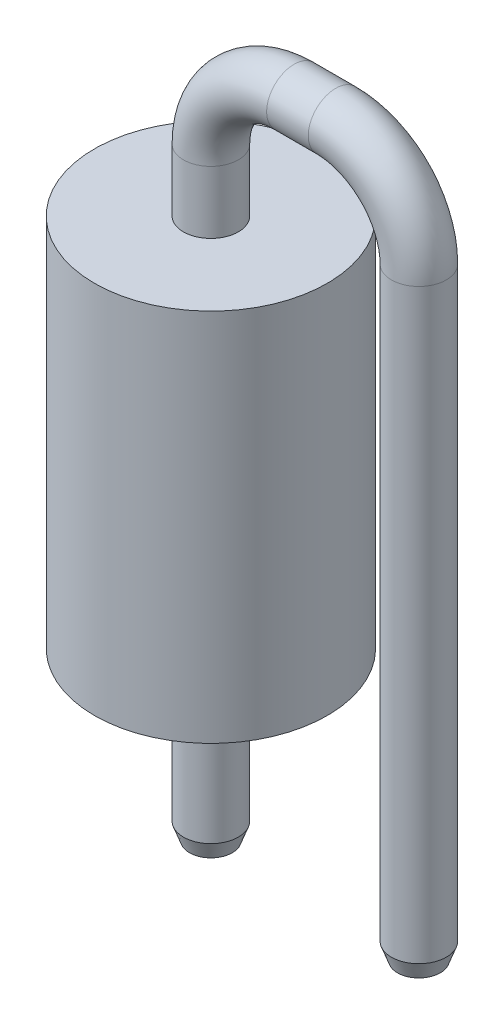
ISO-10303-21;
HEADER;
FILE_DESCRIPTION(('STEP AP214'),'2;1');
FILE_NAME('part.step','',(''),(''),'','','');
FILE_SCHEMA(('AUTOMOTIVE_DESIGN { 1 0 10303 214 1 1 1 1 }'));
ENDSEC;
DATA;
#1=APPLICATION_CONTEXT('core data for automotive mechanical design processes');
#2=APPLICATION_PROTOCOL_DEFINITION('international standard','automotive_design',2000,#1);
#3=PRODUCT_CONTEXT('',#1,'mechanical');
#4=PRODUCT('Part','Part','',(#3));
#5=PRODUCT_RELATED_PRODUCT_CATEGORY('part','',(#4));
#6=PRODUCT_DEFINITION_FORMATION('','',#4);
#7=PRODUCT_DEFINITION_CONTEXT('part definition',#1,'design');
#8=PRODUCT_DEFINITION('design','',#6,#7);
#9=PRODUCT_DEFINITION_SHAPE('','',#8);
#10=(LENGTH_UNIT() NAMED_UNIT(*) SI_UNIT(.MILLI.,.METRE.));
#11=(NAMED_UNIT(*) PLANE_ANGLE_UNIT() SI_UNIT($,.RADIAN.));
#12=(NAMED_UNIT(*) SI_UNIT($,.STERADIAN.) SOLID_ANGLE_UNIT());
#13=UNCERTAINTY_MEASURE_WITH_UNIT(LENGTH_MEASURE(1.E-05),#10,'distance_accuracy_value','');
#14=(GEOMETRIC_REPRESENTATION_CONTEXT(3) GLOBAL_UNCERTAINTY_ASSIGNED_CONTEXT((#13)) GLOBAL_UNIT_ASSIGNED_CONTEXT((#10,
#11,#12)) REPRESENTATION_CONTEXT('',''));
#15=CARTESIAN_POINT('',(0.,0.,0.));
#16=DIRECTION('',(0.,0.,1.));
#17=DIRECTION('',(1.,0.,0.));
#18=AXIS2_PLACEMENT_3D('',#15,#16,#17);
#19=CARTESIAN_POINT('',(5.,14.5,0.));
#20=DIRECTION('',(0.,-1.,0.));
#21=DIRECTION('',(1.,0.,0.));
#22=AXIS2_PLACEMENT_3D('',#19,#20,#21);
#23=CYLINDRICAL_SURFACE('',#22,0.66);
#24=CARTESIAN_POINT('',(5.,0.39999999999997,0.));
#25=DIRECTION('',(0.,-1.,0.));
#26=DIRECTION('',(0.,0.,-1.));
#27=AXIS2_PLACEMENT_3D('',#24,#25,#26);
#28=CIRCLE('',#27,0.66);
#29=CARTESIAN_POINT('',(5.,0.39999999999997,-0.66));
#30=VERTEX_POINT('',#29);
#31=EDGE_CURVE('E56',#30,#30,#28,.F.);
#32=ORIENTED_EDGE('',*,*,#31,.T.);
#33=EDGE_LOOP('',(#32));
#34=FACE_BOUND('',#33,.T.);
#35=CARTESIAN_POINT('',(5.,14.5,0.));
#36=DIRECTION('',(0.,-1.,0.));
#37=DIRECTION('',(0.,0.,1.));
#38=AXIS2_PLACEMENT_3D('',#35,#36,#37);
#39=CIRCLE('',#38,0.66);
#40=CARTESIAN_POINT('',(5.66,14.5,0.));
#41=VERTEX_POINT('',#40);
#42=EDGE_CURVE('E77',#41,#41,#39,.T.);
#43=ORIENTED_EDGE('',*,*,#42,.T.);
#44=EDGE_LOOP('',(#43));
#45=FACE_BOUND('',#44,.T.);
#46=ADVANCED_FACE('F41',(#34,#45),#23,.T.);
#47=CARTESIAN_POINT('',(3.,14.5,0.));
#48=DIRECTION('',(0.,0.,-1.));
#49=DIRECTION('',(-1.,0.,0.));
#50=AXIS2_PLACEMENT_3D('',#47,#48,#49);
#51=TOROIDAL_SURFACE('',#50,2.,0.66);
#52=CARTESIAN_POINT('',(3.,16.5,0.));
#53=DIRECTION('',(1.,0.,0.));
#54=DIRECTION('',(0.,0.,1.));
#55=AXIS2_PLACEMENT_3D('',#52,#53,#54);
#56=CIRCLE('',#55,0.66);
#57=CARTESIAN_POINT('',(3.,17.16,0.));
#58=VERTEX_POINT('',#57);
#59=EDGE_CURVE('E80',#58,#58,#56,.T.);
#60=CARTESIAN_POINT('',(3.,14.5,0.));
#61=DIRECTION('',(0.,0.,-1.));
#62=DIRECTION('',(-1.,0.,0.));
#63=AXIS2_PLACEMENT_3D('',#60,#61,#62);
#64=CIRCLE('',#63,2.66);
#65=EDGE_CURVE('',#58,#41,#64,.T.);
#66=ORIENTED_EDGE('',*,*,#59,.T.);
#67=ORIENTED_EDGE('',*,*,#42,.F.);
#68=ORIENTED_EDGE('',*,*,#65,.T.);
#69=ORIENTED_EDGE('',*,*,#65,.F.);
#70=EDGE_LOOP('',(#66,#68,#67,#69));
#71=FACE_BOUND('',#70,.T.);
#72=ADVANCED_FACE('F132',(#71),#51,.T.);
#73=CARTESIAN_POINT('',(2.,16.5,0.));
#74=DIRECTION('',(1.,0.,0.));
#75=DIRECTION('',(0.,1.,0.));
#76=AXIS2_PLACEMENT_3D('',#73,#74,#75);
#77=CYLINDRICAL_SURFACE('',#76,0.66);
#78=CARTESIAN_POINT('',(2.,16.5,0.));
#79=DIRECTION('',(1.,0.,0.));
#80=DIRECTION('',(0.,0.,1.));
#81=AXIS2_PLACEMENT_3D('',#78,#79,#80);
#82=CIRCLE('',#81,0.66);
#83=CARTESIAN_POINT('',(2.,17.16,0.));
#84=VERTEX_POINT('',#83);
#85=EDGE_CURVE('E84',#84,#84,#82,.T.);
#86=ORIENTED_EDGE('',*,*,#85,.T.);
#87=EDGE_LOOP('',(#86));
#88=FACE_BOUND('',#87,.T.);
#89=ORIENTED_EDGE('',*,*,#59,.F.);
#90=EDGE_LOOP('',(#89));
#91=FACE_BOUND('',#90,.T.);
#92=ADVANCED_FACE('F138',(#88,#91),#77,.T.);
#93=CARTESIAN_POINT('',(2.,14.5,0.));
#94=DIRECTION('',(0.,0.,-1.));
#95=DIRECTION('',(-1.,0.,0.));
#96=AXIS2_PLACEMENT_3D('',#93,#94,#95);
#97=TOROIDAL_SURFACE('',#96,2.,0.66);
#98=CARTESIAN_POINT('',(0.,14.5,0.));
#99=DIRECTION('',(0.,1.,0.));
#100=DIRECTION('',(0.,0.,1.));
#101=AXIS2_PLACEMENT_3D('',#98,#99,#100);
#102=CIRCLE('',#101,0.66);
#103=CARTESIAN_POINT('',(-0.66,14.5,0.));
#104=VERTEX_POINT('',#103);
#105=EDGE_CURVE('E72',#104,#104,#102,.T.);
#106=CARTESIAN_POINT('',(2.,14.5,0.));
#107=DIRECTION('',(0.,0.,-1.));
#108=DIRECTION('',(-1.,0.,0.));
#109=AXIS2_PLACEMENT_3D('',#106,#107,#108);
#110=CIRCLE('',#109,2.66);
#111=EDGE_CURVE('',#104,#84,#110,.T.);
#112=ORIENTED_EDGE('',*,*,#105,.T.);
#113=ORIENTED_EDGE('',*,*,#85,.F.);
#114=ORIENTED_EDGE('',*,*,#111,.T.);
#115=ORIENTED_EDGE('',*,*,#111,.F.);
#116=EDGE_LOOP('',(#112,#114,#113,#115));
#117=FACE_BOUND('',#116,.T.);
#118=ADVANCED_FACE('F129',(#117),#97,.T.);
#119=CARTESIAN_POINT('',(0.,14.5,0.));
#120=DIRECTION('',(0.,-1.,0.));
#121=DIRECTION('',(0.,0.,-1.));
#122=AXIS2_PLACEMENT_3D('',#119,#120,#121);
#123=CYLINDRICAL_SURFACE('',#122,0.66);
#124=CARTESIAN_POINT('',(0.,13.,0.));
#125=DIRECTION('',(0.,1.,0.));
#126=DIRECTION('',(0.,0.,1.));
#127=AXIS2_PLACEMENT_3D('',#124,#125,#126);
#128=CIRCLE('',#127,0.66);
#129=CARTESIAN_POINT('',(0.,13.,0.66));
#130=VERTEX_POINT('',#129);
#131=EDGE_CURVE('E68',#130,#130,#128,.T.);
#132=ORIENTED_EDGE('',*,*,#131,.T.);
#133=EDGE_LOOP('',(#132));
#134=FACE_BOUND('',#133,.T.);
#135=ORIENTED_EDGE('',*,*,#105,.F.);
#136=EDGE_LOOP('',(#135));
#137=FACE_BOUND('',#136,.T.);
#138=ADVANCED_FACE('F119',(#134,#137),#123,.T.);
#139=CARTESIAN_POINT('',(5.,0.,0.));
#140=DIRECTION('',(0.,-1.,0.));
#141=DIRECTION('',(0.,0.,1.));
#142=AXIS2_PLACEMENT_3D('',#139,#140,#141);
#143=PLANE('',#142);
#144=CARTESIAN_POINT('',(5.,0.,0.));
#145=DIRECTION('',(0.,-1.,0.));
#146=DIRECTION('',(1.,0.,0.));
#147=AXIS2_PLACEMENT_3D('',#144,#145,#146);
#148=CIRCLE('',#147,0.514411906293527);
#149=CARTESIAN_POINT('',(5.51441190629353,0.,0.));
#150=VERTEX_POINT('',#149);
#151=EDGE_CURVE('E61',#150,#150,#148,.T.);
#152=ORIENTED_EDGE('',*,*,#151,.T.);
#153=EDGE_LOOP('',(#152));
#154=FACE_BOUND('',#153,.T.);
#155=ADVANCED_FACE('F128',(#154),#143,.T.);
#156=CARTESIAN_POINT('',(0.,13.,0.));
#157=DIRECTION('',(0.,1.,0.));
#158=DIRECTION('',(0.,0.,1.));
#159=AXIS2_PLACEMENT_3D('',#156,#157,#158);
#160=PLANE('',#159);
#161=CARTESIAN_POINT('',(0.,13.,0.));
#162=DIRECTION('',(0.,1.,0.));
#163=DIRECTION('',(0.,0.,1.));
#164=AXIS2_PLACEMENT_3D('',#161,#162,#163);
#165=CIRCLE('',#164,2.8);
#166=CARTESIAN_POINT('',(0.,13.,2.8));
#167=VERTEX_POINT('',#166);
#168=EDGE_CURVE('E73',#167,#167,#165,.T.);
#169=ORIENTED_EDGE('',*,*,#168,.T.);
#170=EDGE_LOOP('',(#169));
#171=FACE_BOUND('',#170,.T.);
#172=ORIENTED_EDGE('',*,*,#131,.F.);
#173=EDGE_LOOP('',(#172));
#174=FACE_BOUND('',#173,.T.);
#175=ADVANCED_FACE('F99',(#171,#174),#160,.T.);
#176=CARTESIAN_POINT('',(0.,4.,0.));
#177=DIRECTION('',(0.,1.,0.));
#178=DIRECTION('',(0.,0.,1.));
#179=AXIS2_PLACEMENT_3D('',#176,#177,#178);
#180=PLANE('',#179);
#181=CARTESIAN_POINT('',(0.,4.,0.));
#182=DIRECTION('',(0.,1.,0.));
#183=DIRECTION('',(0.,0.,1.));
#184=AXIS2_PLACEMENT_3D('',#181,#182,#183);
#185=CIRCLE('',#184,2.8);
#186=CARTESIAN_POINT('',(0.,4.,2.8));
#187=VERTEX_POINT('',#186);
#188=EDGE_CURVE('E91',#187,#187,#185,.T.);
#189=ORIENTED_EDGE('',*,*,#188,.F.);
#190=EDGE_LOOP('',(#189));
#191=FACE_BOUND('',#190,.T.);
#192=CARTESIAN_POINT('',(0.,4.,0.));
#193=DIRECTION('',(0.,1.,0.));
#194=DIRECTION('',(0.,0.,1.));
#195=AXIS2_PLACEMENT_3D('',#192,#193,#194);
#196=CIRCLE('',#195,0.66);
#197=CARTESIAN_POINT('',(0.,4.,0.66));
#198=VERTEX_POINT('',#197);
#199=EDGE_CURVE('E67',#198,#198,#196,.T.);
#200=ORIENTED_EDGE('',*,*,#199,.T.);
#201=EDGE_LOOP('',(#200));
#202=FACE_BOUND('',#201,.T.);
#203=ADVANCED_FACE('F106',(#191,#202),#180,.F.);
#204=CARTESIAN_POINT('',(0.,13.,0.));
#205=DIRECTION('',(0.,-1.,0.));
#206=DIRECTION('',(0.,0.,-1.));
#207=AXIS2_PLACEMENT_3D('',#204,#205,#206);
#208=CYLINDRICAL_SURFACE('',#207,2.8);
#209=ORIENTED_EDGE('',*,*,#168,.F.);
#210=EDGE_LOOP('',(#209));
#211=FACE_BOUND('',#210,.T.);
#212=ORIENTED_EDGE('',*,*,#188,.T.);
#213=EDGE_LOOP('',(#212));
#214=FACE_BOUND('',#213,.T.);
#215=ADVANCED_FACE('F102',(#211,#214),#208,.T.);
#216=CARTESIAN_POINT('',(0.,0.,0.));
#217=DIRECTION('',(0.,1.,0.));
#218=DIRECTION('',(0.,0.,1.));
#219=AXIS2_PLACEMENT_3D('',#216,#217,#218);
#220=PLANE('',#219);
#221=CARTESIAN_POINT('',(0.,0.,0.));
#222=DIRECTION('',(0.,1.,0.));
#223=DIRECTION('',(0.,0.,1.));
#224=AXIS2_PLACEMENT_3D('',#221,#222,#223);
#225=CIRCLE('',#224,0.514411906293526);
#226=CARTESIAN_POINT('',(0.,0.,0.514411906293526));
#227=VERTEX_POINT('',#226);
#228=EDGE_CURVE('E10',#227,#227,#225,.F.);
#229=ORIENTED_EDGE('',*,*,#228,.T.);
#230=EDGE_LOOP('',(#229));
#231=FACE_BOUND('',#230,.T.);
#232=ADVANCED_FACE('F105',(#231),#220,.F.);
#233=CARTESIAN_POINT('',(0.,0.399999999999975,0.));
#234=DIRECTION('',(0.,1.,0.));
#235=DIRECTION('',(0.,0.,1.));
#236=AXIS2_PLACEMENT_3D('',#233,#234,#235);
#237=CIRCLE('',#236,0.66);
#238=CARTESIAN_POINT('',(0.,0.399999999999975,0.66));
#239=VERTEX_POINT('',#238);
#240=EDGE_CURVE('E49',#239,#239,#237,.T.);
#241=ORIENTED_EDGE('',*,*,#240,.T.);
#242=EDGE_LOOP('',(#241));
#243=FACE_BOUND('',#242,.T.);
#244=ORIENTED_EDGE('',*,*,#199,.F.);
#245=EDGE_LOOP('',(#244));
#246=FACE_BOUND('',#245,.T.);
#247=ADVANCED_FACE('F115',(#243,#246),#123,.T.);
#248=CARTESIAN_POINT('',(5.,0.,0.));
#249=DIRECTION('',(0.,1.,0.));
#250=DIRECTION('',(0.,0.,1.));
#251=AXIS2_PLACEMENT_3D('',#248,#249,#250);
#252=CONICAL_SURFACE('',#251,0.514411906293527,0.349065850398871);
#253=ORIENTED_EDGE('',*,*,#31,.F.);
#254=EDGE_LOOP('',(#253));
#255=FACE_BOUND('',#254,.T.);
#256=ORIENTED_EDGE('',*,*,#151,.F.);
#257=EDGE_LOOP('',(#256));
#258=FACE_BOUND('',#257,.T.);
#259=ADVANCED_FACE('F117',(#255,#258),#252,.T.);
#260=CARTESIAN_POINT('',(0.,0.399999999999975,0.));
#261=DIRECTION('',(0.,1.,0.));
#262=DIRECTION('',(0.,0.,1.));
#263=AXIS2_PLACEMENT_3D('',#260,#261,#262);
#264=CONICAL_SURFACE('',#263,0.66,0.349065850398872);
#265=ORIENTED_EDGE('',*,*,#228,.F.);
#266=EDGE_LOOP('',(#265));
#267=FACE_BOUND('',#266,.T.);
#268=ORIENTED_EDGE('',*,*,#240,.F.);
#269=EDGE_LOOP('',(#268));
#270=FACE_BOUND('',#269,.T.);
#271=ADVANCED_FACE('F43',(#267,#270),#264,.T.);
#272=CLOSED_SHELL('',(#46,#72,#92,#118,#138,#155,#175,#203,#215,#232,#247,#259,#271));
#273=MANIFOLD_SOLID_BREP('B2',#272);
#274=ADVANCED_BREP_SHAPE_REPRESENTATION('',(#18,#273),#14);
#275=SHAPE_DEFINITION_REPRESENTATION(#9,#274);
ENDSEC;
END-ISO-10303-21;
